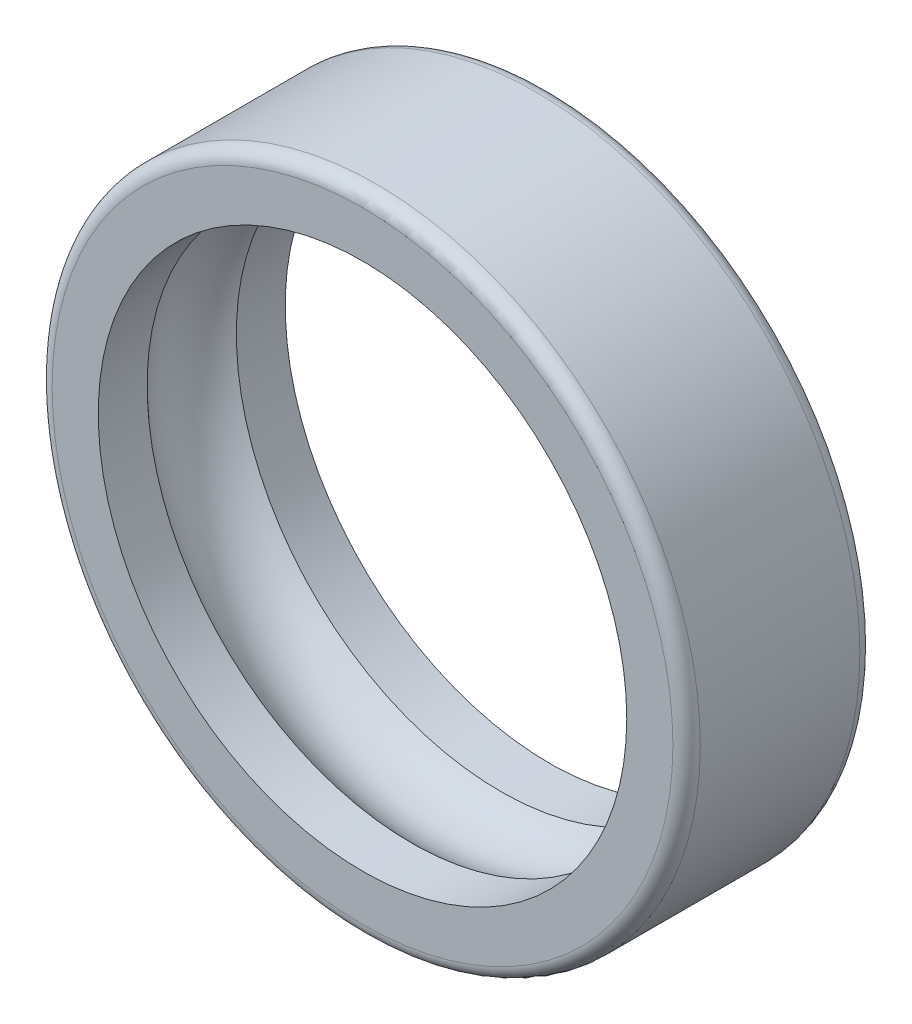
ISO-10303-21;
HEADER;
FILE_DESCRIPTION(('STEP AP214'),'2;1');
FILE_NAME('part.step','',(''),(''),'','','');
FILE_SCHEMA(('AUTOMOTIVE_DESIGN { 1 0 10303 214 1 1 1 1 }'));
ENDSEC;
DATA;
#1=APPLICATION_CONTEXT('core data for automotive mechanical design processes');
#2=APPLICATION_PROTOCOL_DEFINITION('international standard','automotive_design',2000,#1);
#3=PRODUCT_CONTEXT('',#1,'mechanical');
#4=PRODUCT('Part','Part','',(#3));
#5=PRODUCT_RELATED_PRODUCT_CATEGORY('part','',(#4));
#6=PRODUCT_DEFINITION_FORMATION('','',#4);
#7=PRODUCT_DEFINITION_CONTEXT('part definition',#1,'design');
#8=PRODUCT_DEFINITION('design','',#6,#7);
#9=PRODUCT_DEFINITION_SHAPE('','',#8);
#10=(LENGTH_UNIT() NAMED_UNIT(*) SI_UNIT(.MILLI.,.METRE.));
#11=(NAMED_UNIT(*) PLANE_ANGLE_UNIT() SI_UNIT($,.RADIAN.));
#12=(NAMED_UNIT(*) SI_UNIT($,.STERADIAN.) SOLID_ANGLE_UNIT());
#13=UNCERTAINTY_MEASURE_WITH_UNIT(LENGTH_MEASURE(1.E-05),#10,'distance_accuracy_value','');
#14=(GEOMETRIC_REPRESENTATION_CONTEXT(3) GLOBAL_UNCERTAINTY_ASSIGNED_CONTEXT((#13)) GLOBAL_UNIT_ASSIGNED_CONTEXT((#10,
#11,#12)) REPRESENTATION_CONTEXT('',''));
#15=CARTESIAN_POINT('',(0.,0.,0.));
#16=DIRECTION('',(0.,0.,1.));
#17=DIRECTION('',(1.,0.,0.));
#18=AXIS2_PLACEMENT_3D('',#15,#16,#17);
#19=CARTESIAN_POINT('',(0.,0.,0.));
#20=DIRECTION('',(0.,0.,1.));
#21=DIRECTION('',(1.,0.,0.));
#22=AXIS2_PLACEMENT_3D('',#19,#20,#21);
#23=TOROIDAL_SURFACE('',#22,12.42,3.312);
#24=CARTESIAN_POINT('',(0.,0.,2.46861904715977));
#25=DIRECTION('',(0.,0.,1.));
#26=DIRECTION('',(1.,0.,0.));
#27=AXIS2_PLACEMENT_3D('',#24,#25,#26);
#28=CIRCLE('',#27,14.628);
#29=CARTESIAN_POINT('',(14.628,0.,2.46861904715977));
#30=VERTEX_POINT('',#29);
#31=EDGE_CURVE('E69',#30,#30,#28,.T.);
#32=ORIENTED_EDGE('',*,*,#31,.T.);
#33=EDGE_LOOP('',(#32));
#34=FACE_BOUND('',#33,.T.);
#35=CARTESIAN_POINT('',(0.,0.,-2.46861904715977));
#36=DIRECTION('',(0.,0.,1.));
#37=DIRECTION('',(1.,0.,0.));
#38=AXIS2_PLACEMENT_3D('',#35,#36,#37);
#39=CIRCLE('',#38,14.628);
#40=CARTESIAN_POINT('',(14.628,0.,-2.46861904715977));
#41=VERTEX_POINT('',#40);
#42=EDGE_CURVE('E60',#41,#41,#39,.T.);
#43=ORIENTED_EDGE('',*,*,#42,.F.);
#44=EDGE_LOOP('',(#43));
#45=FACE_BOUND('',#44,.T.);
#46=ADVANCED_FACE('F40',(#34,#45),#23,.F.);
#47=CARTESIAN_POINT('',(0.,0.,0.));
#48=DIRECTION('',(0.,0.,1.));
#49=DIRECTION('',(1.,0.,0.));
#50=AXIS2_PLACEMENT_3D('',#47,#48,#49);
#51=CYLINDRICAL_SURFACE('',#50,14.628);
#52=CARTESIAN_POINT('',(0.,0.,-5.175));
#53=DIRECTION('',(0.,0.,1.));
#54=DIRECTION('',(1.,0.,0.));
#55=AXIS2_PLACEMENT_3D('',#52,#53,#54);
#56=CIRCLE('',#55,14.628);
#57=CARTESIAN_POINT('',(14.628,0.,-5.175));
#58=VERTEX_POINT('',#57);
#59=EDGE_CURVE('E63',#58,#58,#56,.T.);
#60=ORIENTED_EDGE('',*,*,#59,.F.);
#61=EDGE_LOOP('',(#60));
#62=FACE_BOUND('',#61,.T.);
#63=ORIENTED_EDGE('',*,*,#42,.T.);
#64=EDGE_LOOP('',(#63));
#65=FACE_BOUND('',#64,.T.);
#66=ADVANCED_FACE('F81',(#62,#65),#51,.F.);
#67=CARTESIAN_POINT('',(0.,0.,-5.175));
#68=DIRECTION('',(0.,0.,1.));
#69=DIRECTION('',(1.,0.,0.));
#70=AXIS2_PLACEMENT_3D('',#67,#68,#69);
#71=PLANE('',#70);
#72=CARTESIAN_POINT('',(0.,0.,-5.175));
#73=DIRECTION('',(0.,0.,1.));
#74=DIRECTION('',(1.,0.,0.));
#75=AXIS2_PLACEMENT_3D('',#72,#73,#74);
#76=CIRCLE('',#75,17.181);
#77=CARTESIAN_POINT('',(17.181,0.,-5.175));
#78=VERTEX_POINT('',#77);
#79=EDGE_CURVE('E10',#78,#78,#76,.F.);
#80=ORIENTED_EDGE('',*,*,#79,.T.);
#81=EDGE_LOOP('',(#80));
#82=FACE_BOUND('',#81,.T.);
#83=ORIENTED_EDGE('',*,*,#59,.T.);
#84=EDGE_LOOP('',(#83));
#85=FACE_BOUND('',#84,.T.);
#86=ADVANCED_FACE('F91',(#82,#85),#71,.F.);
#87=CARTESIAN_POINT('',(0.,0.,0.));
#88=DIRECTION('',(0.,0.,1.));
#89=DIRECTION('',(1.,0.,0.));
#90=AXIS2_PLACEMENT_3D('',#87,#88,#89);
#91=CYLINDRICAL_SURFACE('',#90,17.94);
#92=CARTESIAN_POINT('',(0.,0.,4.416));
#93=DIRECTION('',(0.,0.,1.));
#94=DIRECTION('',(1.,0.,0.));
#95=AXIS2_PLACEMENT_3D('',#92,#93,#94);
#96=CIRCLE('',#95,17.94);
#97=CARTESIAN_POINT('',(17.94,0.,4.416));
#98=VERTEX_POINT('',#97);
#99=EDGE_CURVE('E47',#98,#98,#96,.F.);
#100=ORIENTED_EDGE('',*,*,#99,.T.);
#101=EDGE_LOOP('',(#100));
#102=FACE_BOUND('',#101,.T.);
#103=CARTESIAN_POINT('',(0.,0.,-4.416));
#104=DIRECTION('',(0.,0.,1.));
#105=DIRECTION('',(1.,0.,0.));
#106=AXIS2_PLACEMENT_3D('',#103,#104,#105);
#107=CIRCLE('',#106,17.94);
#108=CARTESIAN_POINT('',(17.94,0.,-4.416));
#109=VERTEX_POINT('',#108);
#110=EDGE_CURVE('E51',#109,#109,#107,.T.);
#111=ORIENTED_EDGE('',*,*,#110,.T.);
#112=EDGE_LOOP('',(#111));
#113=FACE_BOUND('',#112,.T.);
#114=ADVANCED_FACE('F85',(#102,#113),#91,.T.);
#115=CARTESIAN_POINT('',(0.,0.,5.175));
#116=DIRECTION('',(0.,0.,1.));
#117=DIRECTION('',(1.,0.,0.));
#118=AXIS2_PLACEMENT_3D('',#115,#116,#117);
#119=PLANE('',#118);
#120=CARTESIAN_POINT('',(0.,0.,5.175));
#121=DIRECTION('',(0.,0.,1.));
#122=DIRECTION('',(1.,0.,0.));
#123=AXIS2_PLACEMENT_3D('',#120,#121,#122);
#124=CIRCLE('',#123,17.181);
#125=CARTESIAN_POINT('',(17.181,0.,5.175));
#126=VERTEX_POINT('',#125);
#127=EDGE_CURVE('E55',#126,#126,#124,.T.);
#128=ORIENTED_EDGE('',*,*,#127,.T.);
#129=EDGE_LOOP('',(#128));
#130=FACE_BOUND('',#129,.T.);
#131=CARTESIAN_POINT('',(0.,0.,5.175));
#132=DIRECTION('',(0.,0.,1.));
#133=DIRECTION('',(1.,0.,0.));
#134=AXIS2_PLACEMENT_3D('',#131,#132,#133);
#135=CIRCLE('',#134,14.628);
#136=CARTESIAN_POINT('',(14.628,0.,5.175));
#137=VERTEX_POINT('',#136);
#138=EDGE_CURVE('E66',#137,#137,#135,.T.);
#139=ORIENTED_EDGE('',*,*,#138,.F.);
#140=EDGE_LOOP('',(#139));
#141=FACE_BOUND('',#140,.T.);
#142=ADVANCED_FACE('F79',(#130,#141),#119,.T.);
#143=ORIENTED_EDGE('',*,*,#31,.F.);
#144=EDGE_LOOP('',(#143));
#145=FACE_BOUND('',#144,.T.);
#146=ORIENTED_EDGE('',*,*,#138,.T.);
#147=EDGE_LOOP('',(#146));
#148=FACE_BOUND('',#147,.T.);
#149=ADVANCED_FACE('F75',(#145,#148),#51,.F.);
#150=CARTESIAN_POINT('',(0.,0.,4.416));
#151=DIRECTION('',(0.,0.,1.));
#152=DIRECTION('',(1.,0.,0.));
#153=AXIS2_PLACEMENT_3D('',#150,#151,#152);
#154=TOROIDAL_SURFACE('',#153,17.181,0.759);
#155=ORIENTED_EDGE('',*,*,#99,.F.);
#156=EDGE_LOOP('',(#155));
#157=FACE_BOUND('',#156,.T.);
#158=ORIENTED_EDGE('',*,*,#127,.F.);
#159=EDGE_LOOP('',(#158));
#160=FACE_BOUND('',#159,.T.);
#161=ADVANCED_FACE('F78',(#157,#160),#154,.T.);
#162=CARTESIAN_POINT('',(0.,0.,-4.416));
#163=DIRECTION('',(0.,0.,1.));
#164=DIRECTION('',(1.,0.,0.));
#165=AXIS2_PLACEMENT_3D('',#162,#163,#164);
#166=TOROIDAL_SURFACE('',#165,17.181,0.759);
#167=ORIENTED_EDGE('',*,*,#79,.F.);
#168=EDGE_LOOP('',(#167));
#169=FACE_BOUND('',#168,.T.);
#170=ORIENTED_EDGE('',*,*,#110,.F.);
#171=EDGE_LOOP('',(#170));
#172=FACE_BOUND('',#171,.T.);
#173=ADVANCED_FACE('F42',(#169,#172),#166,.T.);
#174=CLOSED_SHELL('',(#46,#66,#86,#114,#142,#149,#161,#173));
#175=MANIFOLD_SOLID_BREP('B2',#174);
#176=ADVANCED_BREP_SHAPE_REPRESENTATION('',(#18,#175),#14);
#177=SHAPE_DEFINITION_REPRESENTATION(#9,#176);
ENDSEC;
END-ISO-10303-21;
